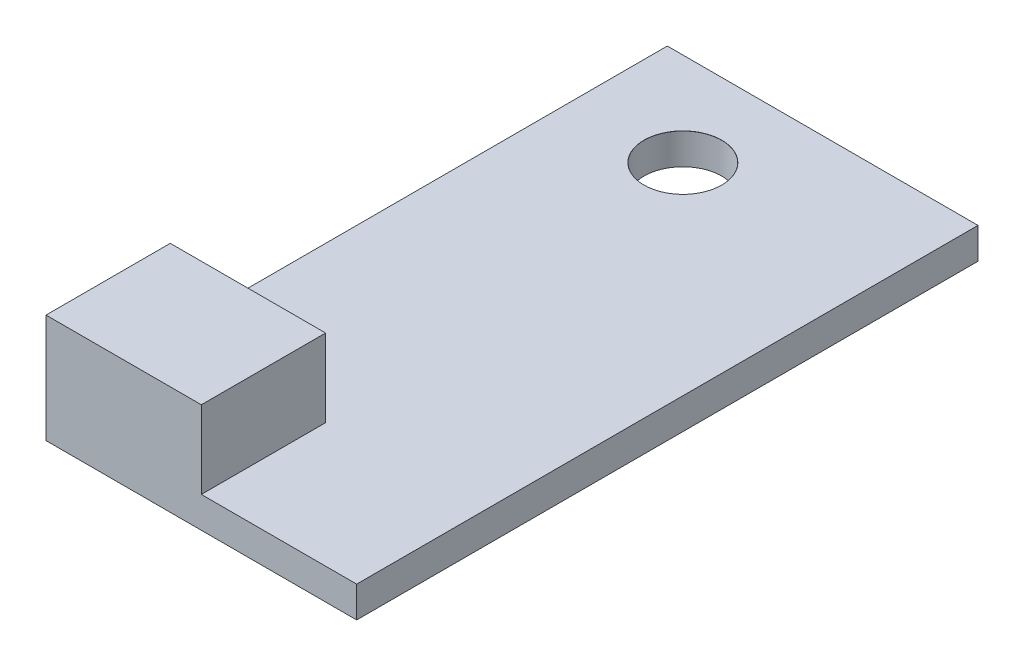
ISO-10303-21;
HEADER;
FILE_DESCRIPTION(('STEP AP214'),'2;1');
FILE_NAME('part.step','',(''),(''),'','','');
FILE_SCHEMA(('AUTOMOTIVE_DESIGN { 1 0 10303 214 1 1 1 1 }'));
ENDSEC;
DATA;
#1=APPLICATION_CONTEXT('core data for automotive mechanical design processes');
#2=APPLICATION_PROTOCOL_DEFINITION('international standard','automotive_design',2000,#1);
#3=PRODUCT_CONTEXT('',#1,'mechanical');
#4=PRODUCT('Part','Part','',(#3));
#5=PRODUCT_RELATED_PRODUCT_CATEGORY('part','',(#4));
#6=PRODUCT_DEFINITION_FORMATION('','',#4);
#7=PRODUCT_DEFINITION_CONTEXT('part definition',#1,'design');
#8=PRODUCT_DEFINITION('design','',#6,#7);
#9=PRODUCT_DEFINITION_SHAPE('','',#8);
#10=(LENGTH_UNIT() NAMED_UNIT(*) SI_UNIT(.MILLI.,.METRE.));
#11=(NAMED_UNIT(*) PLANE_ANGLE_UNIT() SI_UNIT($,.RADIAN.));
#12=(NAMED_UNIT(*) SI_UNIT($,.STERADIAN.) SOLID_ANGLE_UNIT());
#13=UNCERTAINTY_MEASURE_WITH_UNIT(LENGTH_MEASURE(1.E-05),#10,'distance_accuracy_value','');
#14=(GEOMETRIC_REPRESENTATION_CONTEXT(3) GLOBAL_UNCERTAINTY_ASSIGNED_CONTEXT((#13)) GLOBAL_UNIT_ASSIGNED_CONTEXT((#10,
#11,#12)) REPRESENTATION_CONTEXT('',''));
#15=CARTESIAN_POINT('',(0.,0.,0.));
#16=DIRECTION('',(0.,0.,1.));
#17=DIRECTION('',(1.,0.,0.));
#18=AXIS2_PLACEMENT_3D('',#15,#16,#17);
#19=CARTESIAN_POINT('',(0.,10.,0.));
#20=DIRECTION('',(0.,-1.,0.));
#21=DIRECTION('',(0.,0.,-1.));
#22=AXIS2_PLACEMENT_3D('',#19,#20,#21);
#23=PLANE('',#22);
#24=CARTESIAN_POINT('',(35.,10.,-170.));
#25=DIRECTION('',(0.,1.,0.));
#26=DIRECTION('',(0.,0.,1.));
#27=AXIS2_PLACEMENT_3D('',#24,#25,#26);
#28=CIRCLE('',#27,12.525);
#29=CARTESIAN_POINT('',(35.,10.,-157.475));
#30=VERTEX_POINT('',#29);
#31=EDGE_CURVE('E269',#30,#30,#28,.T.);
#32=ORIENTED_EDGE('',*,*,#31,.F.);
#33=EDGE_LOOP('',(#32));
#34=FACE_BOUND('',#33,.T.);
#35=DIRECTION('',(-1.,0.,0.));
#36=VECTOR('',#35,1.);
#37=CARTESIAN_POINT('',(0.,10.,-40.));
#38=LINE('',#37,#36);
#39=CARTESIAN_POINT('',(50.,10.,-40.));
#40=VERTEX_POINT('',#39);
#41=CARTESIAN_POINT('',(0.,10.,-40.));
#42=VERTEX_POINT('',#41);
#43=EDGE_CURVE('E112',#40,#42,#38,.T.);
#44=ORIENTED_EDGE('',*,*,#43,.F.);
#45=DIRECTION('',(0.,0.,-1.));
#46=VECTOR('',#45,1.);
#47=CARTESIAN_POINT('',(50.,10.,0.));
#48=LINE('',#47,#46);
#49=CARTESIAN_POINT('',(50.,10.,0.));
#50=VERTEX_POINT('',#49);
#51=EDGE_CURVE('E48',#50,#40,#48,.T.);
#52=ORIENTED_EDGE('',*,*,#51,.F.);
#53=DIRECTION('',(1.,0.,0.));
#54=VECTOR('',#53,1.);
#55=CARTESIAN_POINT('',(0.,10.,0.));
#56=LINE('',#55,#54);
#57=CARTESIAN_POINT('',(100.,10.,0.));
#58=VERTEX_POINT('',#57);
#59=EDGE_CURVE('E129',#50,#58,#56,.T.);
#60=ORIENTED_EDGE('',*,*,#59,.T.);
#61=DIRECTION('',(0.,0.,-1.));
#62=VECTOR('',#61,1.);
#63=CARTESIAN_POINT('',(100.,10.,0.));
#64=LINE('',#63,#62);
#65=CARTESIAN_POINT('',(100.,10.,-200.));
#66=VERTEX_POINT('',#65);
#67=EDGE_CURVE('E132',#58,#66,#64,.T.);
#68=ORIENTED_EDGE('',*,*,#67,.T.);
#69=DIRECTION('',(-1.,0.,0.));
#70=VECTOR('',#69,1.);
#71=CARTESIAN_POINT('',(0.,10.,-200.));
#72=LINE('',#71,#70);
#73=CARTESIAN_POINT('',(0.,10.,-200.));
#74=VERTEX_POINT('',#73);
#75=EDGE_CURVE('E134',#66,#74,#72,.T.);
#76=ORIENTED_EDGE('',*,*,#75,.T.);
#77=DIRECTION('',(0.,0.,1.));
#78=VECTOR('',#77,1.);
#79=CARTESIAN_POINT('',(0.,10.,0.));
#80=LINE('',#79,#78);
#81=EDGE_CURVE('E54',#74,#42,#80,.T.);
#82=ORIENTED_EDGE('',*,*,#81,.T.);
#83=EDGE_LOOP('',(#44,#52,#60,#68,#76,#82));
#84=FACE_BOUND('',#83,.T.);
#85=ADVANCED_FACE('F33',(#34,#84),#23,.F.);
#86=CARTESIAN_POINT('',(0.,10.,0.));
#87=DIRECTION('',(1.,0.,0.));
#88=DIRECTION('',(0.,0.,-1.));
#89=AXIS2_PLACEMENT_3D('',#86,#87,#88);
#90=PLANE('',#89);
#91=DIRECTION('',(0.,0.,1.));
#92=VECTOR('',#91,1.);
#93=CARTESIAN_POINT('',(0.,0.,0.));
#94=LINE('',#93,#92);
#95=CARTESIAN_POINT('',(0.,0.,-200.));
#96=VERTEX_POINT('',#95);
#97=CARTESIAN_POINT('',(0.,0.,0.));
#98=VERTEX_POINT('',#97);
#99=EDGE_CURVE('E97',#96,#98,#94,.T.);
#100=ORIENTED_EDGE('',*,*,#99,.T.);
#101=DIRECTION('',(0.,-1.,0.));
#102=VECTOR('',#101,1.);
#103=CARTESIAN_POINT('',(0.,10.,0.));
#104=LINE('',#103,#102);
#105=CARTESIAN_POINT('',(0.,35.,0.));
#106=VERTEX_POINT('',#105);
#107=EDGE_CURVE('E11',#106,#98,#104,.T.);
#108=ORIENTED_EDGE('',*,*,#107,.F.);
#109=DIRECTION('',(0.,0.,1.));
#110=VECTOR('',#109,1.);
#111=CARTESIAN_POINT('',(0.,35.,0.));
#112=LINE('',#111,#110);
#113=CARTESIAN_POINT('',(0.,35.,-40.));
#114=VERTEX_POINT('',#113);
#115=EDGE_CURVE('E94',#114,#106,#112,.T.);
#116=ORIENTED_EDGE('',*,*,#115,.F.);
#117=DIRECTION('',(0.,-1.,0.));
#118=VECTOR('',#117,1.);
#119=CARTESIAN_POINT('',(0.,35.,-40.));
#120=LINE('',#119,#118);
#121=EDGE_CURVE('E121',#114,#42,#120,.T.);
#122=ORIENTED_EDGE('',*,*,#121,.T.);
#123=ORIENTED_EDGE('',*,*,#81,.F.);
#124=DIRECTION('',(0.,-1.,0.));
#125=VECTOR('',#124,1.);
#126=CARTESIAN_POINT('',(0.,10.,-200.));
#127=LINE('',#126,#125);
#128=EDGE_CURVE('E136',#74,#96,#127,.T.);
#129=ORIENTED_EDGE('',*,*,#128,.T.);
#130=EDGE_LOOP('',(#100,#108,#116,#122,#123,#129));
#131=FACE_BOUND('',#130,.T.);
#132=ADVANCED_FACE('F35',(#131),#90,.F.);
#133=CARTESIAN_POINT('',(0.,10.,0.));
#134=DIRECTION('',(0.,0.,-1.));
#135=DIRECTION('',(-1.,0.,0.));
#136=AXIS2_PLACEMENT_3D('',#133,#134,#135);
#137=PLANE('',#136);
#138=DIRECTION('',(1.,0.,0.));
#139=VECTOR('',#138,1.);
#140=CARTESIAN_POINT('',(0.,0.,0.));
#141=LINE('',#140,#139);
#142=CARTESIAN_POINT('',(100.,0.,0.));
#143=VERTEX_POINT('',#142);
#144=EDGE_CURVE('E138',#98,#143,#141,.T.);
#145=ORIENTED_EDGE('',*,*,#144,.T.);
#146=DIRECTION('',(0.,-1.,0.));
#147=VECTOR('',#146,1.);
#148=CARTESIAN_POINT('',(100.,10.,0.));
#149=LINE('',#148,#147);
#150=EDGE_CURVE('E41',#58,#143,#149,.T.);
#151=ORIENTED_EDGE('',*,*,#150,.F.);
#152=ORIENTED_EDGE('',*,*,#59,.F.);
#153=DIRECTION('',(0.,-1.,0.));
#154=VECTOR('',#153,1.);
#155=CARTESIAN_POINT('',(50.,35.,0.));
#156=LINE('',#155,#154);
#157=CARTESIAN_POINT('',(50.,35.,0.));
#158=VERTEX_POINT('',#157);
#159=EDGE_CURVE('E103',#158,#50,#156,.T.);
#160=ORIENTED_EDGE('',*,*,#159,.F.);
#161=DIRECTION('',(1.,0.,0.));
#162=VECTOR('',#161,1.);
#163=CARTESIAN_POINT('',(0.,35.,0.));
#164=LINE('',#163,#162);
#165=EDGE_CURVE('E100',#106,#158,#164,.T.);
#166=ORIENTED_EDGE('',*,*,#165,.F.);
#167=ORIENTED_EDGE('',*,*,#107,.T.);
#168=EDGE_LOOP('',(#145,#151,#152,#160,#166,#167));
#169=FACE_BOUND('',#168,.T.);
#170=ADVANCED_FACE('F101',(#169),#137,.F.);
#171=CARTESIAN_POINT('',(100.,10.,0.));
#172=DIRECTION('',(-1.,0.,0.));
#173=DIRECTION('',(0.,0.,1.));
#174=AXIS2_PLACEMENT_3D('',#171,#172,#173);
#175=PLANE('',#174);
#176=DIRECTION('',(0.,0.,-1.));
#177=VECTOR('',#176,1.);
#178=CARTESIAN_POINT('',(100.,0.,0.));
#179=LINE('',#178,#177);
#180=CARTESIAN_POINT('',(100.,0.,-200.));
#181=VERTEX_POINT('',#180);
#182=EDGE_CURVE('E140',#143,#181,#179,.T.);
#183=ORIENTED_EDGE('',*,*,#182,.T.);
#184=DIRECTION('',(0.,-1.,0.));
#185=VECTOR('',#184,1.);
#186=CARTESIAN_POINT('',(100.,10.,-200.));
#187=LINE('',#186,#185);
#188=EDGE_CURVE('E144',#66,#181,#187,.T.);
#189=ORIENTED_EDGE('',*,*,#188,.F.);
#190=ORIENTED_EDGE('',*,*,#67,.F.);
#191=ORIENTED_EDGE('',*,*,#150,.T.);
#192=EDGE_LOOP('',(#183,#189,#190,#191));
#193=FACE_BOUND('',#192,.T.);
#194=ADVANCED_FACE('F151',(#193),#175,.F.);
#195=CARTESIAN_POINT('',(0.,10.,-200.));
#196=DIRECTION('',(0.,0.,1.));
#197=DIRECTION('',(1.,0.,0.));
#198=AXIS2_PLACEMENT_3D('',#195,#196,#197);
#199=PLANE('',#198);
#200=DIRECTION('',(-1.,0.,0.));
#201=VECTOR('',#200,1.);
#202=CARTESIAN_POINT('',(0.,0.,-200.));
#203=LINE('',#202,#201);
#204=EDGE_CURVE('E130',#181,#96,#203,.T.);
#205=ORIENTED_EDGE('',*,*,#204,.T.);
#206=ORIENTED_EDGE('',*,*,#128,.F.);
#207=ORIENTED_EDGE('',*,*,#75,.F.);
#208=ORIENTED_EDGE('',*,*,#188,.T.);
#209=EDGE_LOOP('',(#205,#206,#207,#208));
#210=FACE_BOUND('',#209,.T.);
#211=ADVANCED_FACE('F158',(#210),#199,.F.);
#212=CARTESIAN_POINT('',(0.,0.,0.));
#213=DIRECTION('',(0.,-1.,0.));
#214=DIRECTION('',(0.,0.,-1.));
#215=AXIS2_PLACEMENT_3D('',#212,#213,#214);
#216=PLANE('',#215);
#217=CARTESIAN_POINT('',(35.,0.,-170.));
#218=DIRECTION('',(0.,1.,0.));
#219=DIRECTION('',(0.,0.,1.));
#220=AXIS2_PLACEMENT_3D('',#217,#218,#219);
#221=CIRCLE('',#220,12.5);
#222=CARTESIAN_POINT('',(35.,0.,-157.5));
#223=VERTEX_POINT('',#222);
#224=EDGE_CURVE('E116',#223,#223,#221,.T.);
#225=ORIENTED_EDGE('',*,*,#224,.T.);
#226=EDGE_LOOP('',(#225));
#227=FACE_BOUND('',#226,.T.);
#228=ORIENTED_EDGE('',*,*,#99,.F.);
#229=ORIENTED_EDGE('',*,*,#204,.F.);
#230=ORIENTED_EDGE('',*,*,#182,.F.);
#231=ORIENTED_EDGE('',*,*,#144,.F.);
#232=EDGE_LOOP('',(#228,#229,#230,#231));
#233=FACE_BOUND('',#232,.T.);
#234=ADVANCED_FACE('F155',(#227,#233),#216,.T.);
#235=CARTESIAN_POINT('',(50.,35.,0.));
#236=DIRECTION('',(-1.,0.,0.));
#237=DIRECTION('',(0.,0.,1.));
#238=AXIS2_PLACEMENT_3D('',#235,#236,#237);
#239=PLANE('',#238);
#240=ORIENTED_EDGE('',*,*,#51,.T.);
#241=DIRECTION('',(0.,-1.,0.));
#242=VECTOR('',#241,1.);
#243=CARTESIAN_POINT('',(50.,35.,-40.));
#244=LINE('',#243,#242);
#245=CARTESIAN_POINT('',(50.,35.,-40.));
#246=VERTEX_POINT('',#245);
#247=EDGE_CURVE('E124',#246,#40,#244,.T.);
#248=ORIENTED_EDGE('',*,*,#247,.F.);
#249=DIRECTION('',(0.,0.,-1.));
#250=VECTOR('',#249,1.);
#251=CARTESIAN_POINT('',(50.,35.,0.));
#252=LINE('',#251,#250);
#253=EDGE_CURVE('E106',#158,#246,#252,.T.);
#254=ORIENTED_EDGE('',*,*,#253,.F.);
#255=ORIENTED_EDGE('',*,*,#159,.T.);
#256=EDGE_LOOP('',(#240,#248,#254,#255));
#257=FACE_BOUND('',#256,.T.);
#258=ADVANCED_FACE('F164',(#257),#239,.F.);
#259=CARTESIAN_POINT('',(0.,35.,-40.));
#260=DIRECTION('',(0.,0.,1.));
#261=DIRECTION('',(1.,0.,0.));
#262=AXIS2_PLACEMENT_3D('',#259,#260,#261);
#263=PLANE('',#262);
#264=ORIENTED_EDGE('',*,*,#43,.T.);
#265=ORIENTED_EDGE('',*,*,#121,.F.);
#266=DIRECTION('',(-1.,0.,0.));
#267=VECTOR('',#266,1.);
#268=CARTESIAN_POINT('',(0.,35.,-40.));
#269=LINE('',#268,#267);
#270=EDGE_CURVE('E110',#246,#114,#269,.T.);
#271=ORIENTED_EDGE('',*,*,#270,.F.);
#272=ORIENTED_EDGE('',*,*,#247,.T.);
#273=EDGE_LOOP('',(#264,#265,#271,#272));
#274=FACE_BOUND('',#273,.T.);
#275=ADVANCED_FACE('F161',(#274),#263,.F.);
#276=CARTESIAN_POINT('',(0.,35.,0.));
#277=DIRECTION('',(0.,-1.,0.));
#278=DIRECTION('',(0.,0.,-1.));
#279=AXIS2_PLACEMENT_3D('',#276,#277,#278);
#280=PLANE('',#279);
#281=ORIENTED_EDGE('',*,*,#115,.T.);
#282=ORIENTED_EDGE('',*,*,#165,.T.);
#283=ORIENTED_EDGE('',*,*,#253,.T.);
#284=ORIENTED_EDGE('',*,*,#270,.T.);
#285=EDGE_LOOP('',(#281,#282,#283,#284));
#286=FACE_BOUND('',#285,.T.);
#287=ADVANCED_FACE('F108',(#286),#280,.F.);
#288=CARTESIAN_POINT('',(35.,10.,-170.));
#289=DIRECTION('',(0.,1.,0.));
#290=DIRECTION('',(0.,0.,1.));
#291=AXIS2_PLACEMENT_3D('',#288,#289,#290);
#292=CYLINDRICAL_SURFACE('',#291,12.5);
#293=ORIENTED_EDGE('',*,*,#224,.F.);
#294=EDGE_LOOP('',(#293));
#295=FACE_BOUND('',#294,.T.);
#296=CARTESIAN_POINT('',(35.,9.97499999999997,-170.));
#297=DIRECTION('',(0.,1.,0.));
#298=DIRECTION('',(0.,0.,1.));
#299=AXIS2_PLACEMENT_3D('',#296,#297,#298);
#300=CIRCLE('',#299,12.5);
#301=CARTESIAN_POINT('',(35.,9.97499999999997,-157.5));
#302=VERTEX_POINT('',#301);
#303=EDGE_CURVE('E267',#302,#302,#300,.T.);
#304=ORIENTED_EDGE('',*,*,#303,.T.);
#305=EDGE_LOOP('',(#304));
#306=FACE_BOUND('',#305,.T.);
#307=ADVANCED_FACE('F210',(#295,#306),#292,.F.);
#308=CARTESIAN_POINT('',(35.,10.,-170.));
#309=DIRECTION('',(0.,1.,0.));
#310=DIRECTION('',(0.,0.,1.));
#311=AXIS2_PLACEMENT_3D('',#308,#309,#310);
#312=CONICAL_SURFACE('',#311,12.525,0.785398163397171);
#313=ORIENTED_EDGE('',*,*,#303,.F.);
#314=EDGE_LOOP('',(#313));
#315=FACE_BOUND('',#314,.T.);
#316=ORIENTED_EDGE('',*,*,#31,.T.);
#317=EDGE_LOOP('',(#316));
#318=FACE_BOUND('',#317,.T.);
#319=ADVANCED_FACE('F215',(#315,#318),#312,.F.);
#320=CLOSED_SHELL('',(#85,#132,#170,#194,#211,#234,#258,#275,#287,#307,#319));
#321=MANIFOLD_SOLID_BREP('B2',#320);
#322=ADVANCED_BREP_SHAPE_REPRESENTATION('',(#18,#321),#14);
#323=SHAPE_DEFINITION_REPRESENTATION(#9,#322);
ENDSEC;
END-ISO-10303-21;
